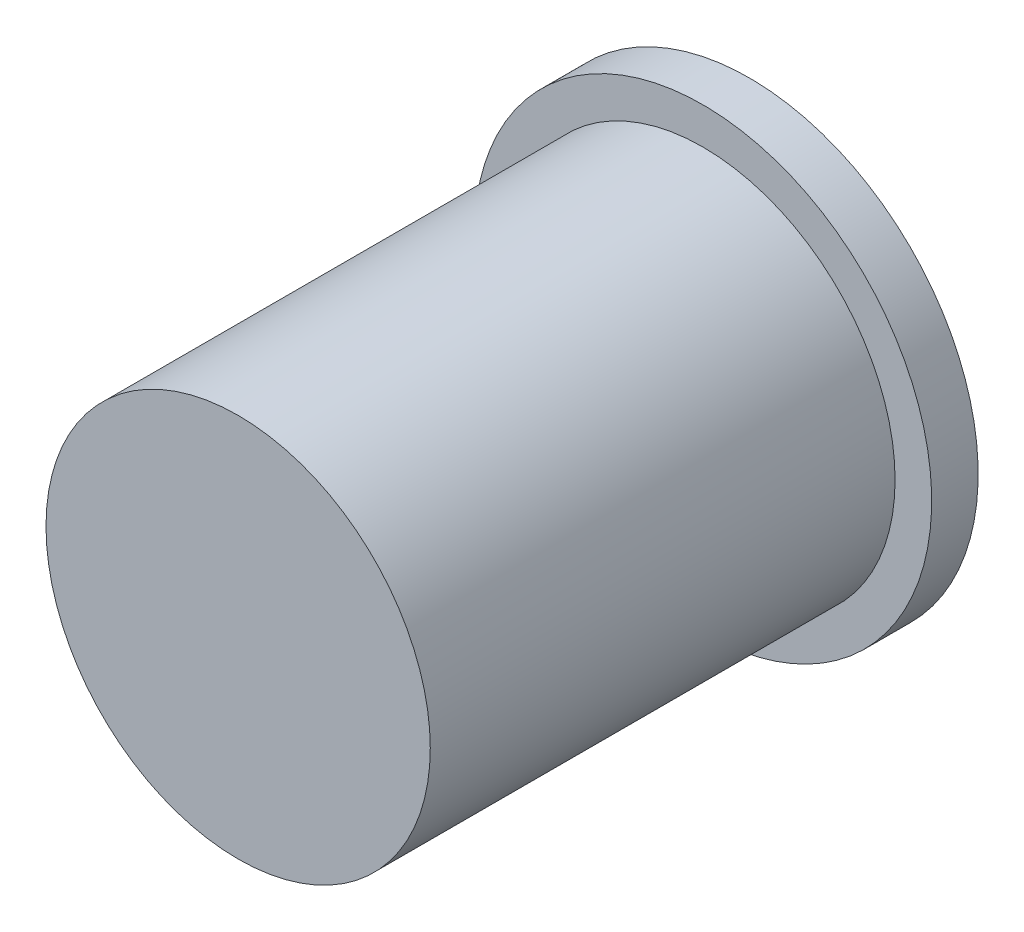
ISO-10303-21;
HEADER;
FILE_DESCRIPTION(('STEP AP214'),'2;1');
FILE_NAME('part.step','',(''),(''),'','','');
FILE_SCHEMA(('AUTOMOTIVE_DESIGN { 1 0 10303 214 1 1 1 1 }'));
ENDSEC;
DATA;
#1=APPLICATION_CONTEXT('core data for automotive mechanical design processes');
#2=APPLICATION_PROTOCOL_DEFINITION('international standard','automotive_design',2000,#1);
#3=PRODUCT_CONTEXT('',#1,'mechanical');
#4=PRODUCT('Part','Part','',(#3));
#5=PRODUCT_RELATED_PRODUCT_CATEGORY('part','',(#4));
#6=PRODUCT_DEFINITION_FORMATION('','',#4);
#7=PRODUCT_DEFINITION_CONTEXT('part definition',#1,'design');
#8=PRODUCT_DEFINITION('design','',#6,#7);
#9=PRODUCT_DEFINITION_SHAPE('','',#8);
#10=(LENGTH_UNIT() NAMED_UNIT(*) SI_UNIT(.MILLI.,.METRE.));
#11=(NAMED_UNIT(*) PLANE_ANGLE_UNIT() SI_UNIT($,.RADIAN.));
#12=(NAMED_UNIT(*) SI_UNIT($,.STERADIAN.) SOLID_ANGLE_UNIT());
#13=UNCERTAINTY_MEASURE_WITH_UNIT(LENGTH_MEASURE(1.E-05),#10,'distance_accuracy_value','');
#14=(GEOMETRIC_REPRESENTATION_CONTEXT(3) GLOBAL_UNCERTAINTY_ASSIGNED_CONTEXT((#13)) GLOBAL_UNIT_ASSIGNED_CONTEXT((#10,
#11,#12)) REPRESENTATION_CONTEXT('',''));
#15=CARTESIAN_POINT('',(0.,0.,0.));
#16=DIRECTION('',(0.,0.,1.));
#17=DIRECTION('',(1.,0.,0.));
#18=AXIS2_PLACEMENT_3D('',#15,#16,#17);
#19=CARTESIAN_POINT('',(0.,0.,27.94));
#20=DIRECTION('',(0.,0.,-1.));
#21=DIRECTION('',(-1.,0.,0.));
#22=AXIS2_PLACEMENT_3D('',#19,#20,#21);
#23=CYLINDRICAL_SURFACE('',#22,10.5);
#24=CARTESIAN_POINT('',(0.,0.,27.94));
#25=DIRECTION('',(0.,0.,1.));
#26=DIRECTION('',(1.,0.,0.));
#27=AXIS2_PLACEMENT_3D('',#24,#25,#26);
#28=CIRCLE('',#27,10.5);
#29=CARTESIAN_POINT('',(10.5,0.,27.94));
#30=VERTEX_POINT('',#29);
#31=EDGE_CURVE('E38',#30,#30,#28,.T.);
#32=ORIENTED_EDGE('',*,*,#31,.F.);
#33=EDGE_LOOP('',(#32));
#34=FACE_BOUND('',#33,.T.);
#35=CARTESIAN_POINT('',(0.,0.,2.54));
#36=DIRECTION('',(0.,0.,-1.));
#37=DIRECTION('',(-1.,0.,0.));
#38=AXIS2_PLACEMENT_3D('',#35,#36,#37);
#39=CIRCLE('',#38,10.5);
#40=CARTESIAN_POINT('',(-10.5,0.,2.54));
#41=VERTEX_POINT('',#40);
#42=EDGE_CURVE('E10',#41,#41,#39,.T.);
#43=ORIENTED_EDGE('',*,*,#42,.F.);
#44=EDGE_LOOP('',(#43));
#45=FACE_BOUND('',#44,.T.);
#46=ADVANCED_FACE('F32',(#34,#45),#23,.T.);
#47=CARTESIAN_POINT('',(0.,0.,27.94));
#48=DIRECTION('',(0.,0.,1.));
#49=DIRECTION('',(1.,0.,0.));
#50=AXIS2_PLACEMENT_3D('',#47,#48,#49);
#51=PLANE('',#50);
#52=ORIENTED_EDGE('',*,*,#31,.T.);
#53=EDGE_LOOP('',(#52));
#54=FACE_BOUND('',#53,.T.);
#55=ADVANCED_FACE('F79',(#54),#51,.T.);
#56=CARTESIAN_POINT('',(0.,0.,2.54));
#57=DIRECTION('',(0.,0.,-1.));
#58=DIRECTION('',(-1.,0.,0.));
#59=AXIS2_PLACEMENT_3D('',#56,#57,#58);
#60=PLANE('',#59);
#61=CARTESIAN_POINT('',(0.,0.,2.54));
#62=DIRECTION('',(0.,0.,-1.));
#63=DIRECTION('',(-1.,0.,0.));
#64=AXIS2_PLACEMENT_3D('',#61,#62,#63);
#65=CIRCLE('',#64,12.5);
#66=CARTESIAN_POINT('',(-12.5,0.,2.54));
#67=VERTEX_POINT('',#66);
#68=EDGE_CURVE('E42',#67,#67,#65,.T.);
#69=ORIENTED_EDGE('',*,*,#68,.F.);
#70=EDGE_LOOP('',(#69));
#71=FACE_BOUND('',#70,.T.);
#72=ORIENTED_EDGE('',*,*,#42,.T.);
#73=EDGE_LOOP('',(#72));
#74=FACE_BOUND('',#73,.T.);
#75=ADVANCED_FACE('F73',(#71,#74),#60,.F.);
#76=CARTESIAN_POINT('',(0.,0.,2.54));
#77=DIRECTION('',(0.,0.,-1.));
#78=DIRECTION('',(-1.,0.,0.));
#79=AXIS2_PLACEMENT_3D('',#76,#77,#78);
#80=CYLINDRICAL_SURFACE('',#79,12.5);
#81=ORIENTED_EDGE('',*,*,#68,.T.);
#82=EDGE_LOOP('',(#81));
#83=FACE_BOUND('',#82,.T.);
#84=CARTESIAN_POINT('',(0.,0.,0.));
#85=DIRECTION('',(0.,0.,-1.));
#86=DIRECTION('',(-1.,0.,0.));
#87=AXIS2_PLACEMENT_3D('',#84,#85,#86);
#88=CIRCLE('',#87,12.5);
#89=CARTESIAN_POINT('',(-12.5,0.,0.));
#90=VERTEX_POINT('',#89);
#91=EDGE_CURVE('E46',#90,#90,#88,.T.);
#92=ORIENTED_EDGE('',*,*,#91,.F.);
#93=EDGE_LOOP('',(#92));
#94=FACE_BOUND('',#93,.T.);
#95=ADVANCED_FACE('F69',(#83,#94),#80,.T.);
#96=CARTESIAN_POINT('',(0.,0.,0.));
#97=DIRECTION('',(0.,0.,1.));
#98=DIRECTION('',(1.,0.,0.));
#99=AXIS2_PLACEMENT_3D('',#96,#97,#98);
#100=PLANE('',#99);
#101=CARTESIAN_POINT('',(0.,0.,0.));
#102=DIRECTION('',(0.,0.,-1.));
#103=DIRECTION('',(-1.,0.,0.));
#104=AXIS2_PLACEMENT_3D('',#101,#102,#103);
#105=CIRCLE('',#104,10.);
#106=CARTESIAN_POINT('',(-10.,0.,0.));
#107=VERTEX_POINT('',#106);
#108=EDGE_CURVE('E52',#107,#107,#105,.T.);
#109=ORIENTED_EDGE('',*,*,#108,.F.);
#110=EDGE_LOOP('',(#109));
#111=FACE_BOUND('',#110,.T.);
#112=ORIENTED_EDGE('',*,*,#91,.T.);
#113=EDGE_LOOP('',(#112));
#114=FACE_BOUND('',#113,.T.);
#115=ADVANCED_FACE('F63',(#111,#114),#100,.F.);
#116=CARTESIAN_POINT('',(0.,0.,25.4));
#117=DIRECTION('',(0.,0.,-1.));
#118=DIRECTION('',(-1.,0.,0.));
#119=AXIS2_PLACEMENT_3D('',#116,#117,#118);
#120=CYLINDRICAL_SURFACE('',#119,10.);
#121=CARTESIAN_POINT('',(0.,0.,25.4));
#122=DIRECTION('',(0.,0.,-1.));
#123=DIRECTION('',(-1.,0.,0.));
#124=AXIS2_PLACEMENT_3D('',#121,#122,#123);
#125=CIRCLE('',#124,10.);
#126=CARTESIAN_POINT('',(-10.,0.,25.4));
#127=VERTEX_POINT('',#126);
#128=EDGE_CURVE('E50',#127,#127,#125,.T.);
#129=ORIENTED_EDGE('',*,*,#128,.F.);
#130=EDGE_LOOP('',(#129));
#131=FACE_BOUND('',#130,.T.);
#132=ORIENTED_EDGE('',*,*,#108,.T.);
#133=EDGE_LOOP('',(#132));
#134=FACE_BOUND('',#133,.T.);
#135=ADVANCED_FACE('F60',(#131,#134),#120,.F.);
#136=CARTESIAN_POINT('',(0.,0.,25.4));
#137=DIRECTION('',(0.,0.,-1.));
#138=DIRECTION('',(-1.,0.,0.));
#139=AXIS2_PLACEMENT_3D('',#136,#137,#138);
#140=PLANE('',#139);
#141=ORIENTED_EDGE('',*,*,#128,.T.);
#142=EDGE_LOOP('',(#141));
#143=FACE_BOUND('',#142,.T.);
#144=ADVANCED_FACE('F58',(#143),#140,.T.);
#145=CLOSED_SHELL('',(#46,#55,#75,#95,#115,#135,#144));
#146=MANIFOLD_SOLID_BREP('B2',#145);
#147=ADVANCED_BREP_SHAPE_REPRESENTATION('',(#18,#146),#14);
#148=SHAPE_DEFINITION_REPRESENTATION(#9,#147);
ENDSEC;
END-ISO-10303-21;
